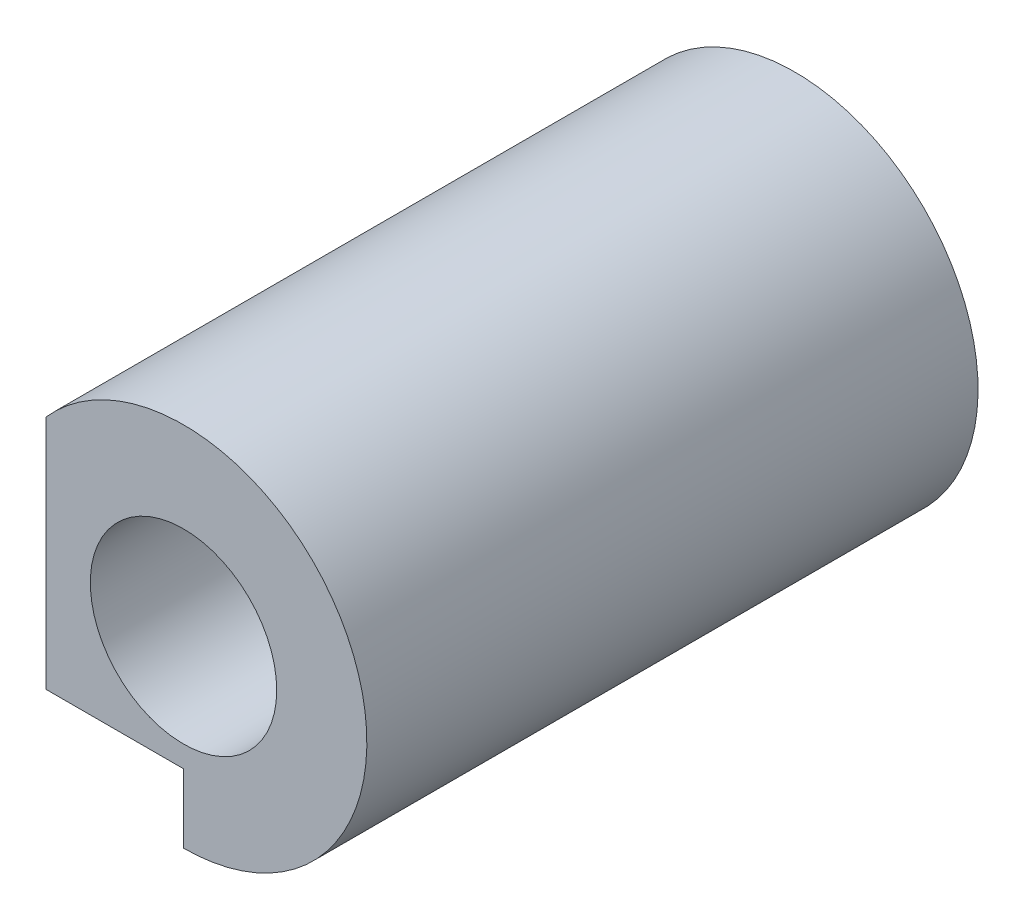
ISO-10303-21;
HEADER;
FILE_DESCRIPTION(('STEP AP214'),'2;1');
FILE_NAME('part.step','',(''),(''),'','','');
FILE_SCHEMA(('AUTOMOTIVE_DESIGN { 1 0 10303 214 1 1 1 1 }'));
ENDSEC;
DATA;
#1=APPLICATION_CONTEXT('core data for automotive mechanical design processes');
#2=APPLICATION_PROTOCOL_DEFINITION('international standard','automotive_design',2000,#1);
#3=PRODUCT_CONTEXT('',#1,'mechanical');
#4=PRODUCT('Part','Part','',(#3));
#5=PRODUCT_RELATED_PRODUCT_CATEGORY('part','',(#4));
#6=PRODUCT_DEFINITION_FORMATION('','',#4);
#7=PRODUCT_DEFINITION_CONTEXT('part definition',#1,'design');
#8=PRODUCT_DEFINITION('design','',#6,#7);
#9=PRODUCT_DEFINITION_SHAPE('','',#8);
#10=(LENGTH_UNIT() NAMED_UNIT(*) SI_UNIT(.MILLI.,.METRE.));
#11=(NAMED_UNIT(*) PLANE_ANGLE_UNIT() SI_UNIT($,.RADIAN.));
#12=(NAMED_UNIT(*) SI_UNIT($,.STERADIAN.) SOLID_ANGLE_UNIT());
#13=UNCERTAINTY_MEASURE_WITH_UNIT(LENGTH_MEASURE(1.E-05),#10,'distance_accuracy_value','');
#14=(GEOMETRIC_REPRESENTATION_CONTEXT(3) GLOBAL_UNCERTAINTY_ASSIGNED_CONTEXT((#13)) GLOBAL_UNIT_ASSIGNED_CONTEXT((#10,
#11,#12)) REPRESENTATION_CONTEXT('',''));
#15=CARTESIAN_POINT('',(0.,0.,0.));
#16=DIRECTION('',(0.,0.,1.));
#17=DIRECTION('',(1.,0.,0.));
#18=AXIS2_PLACEMENT_3D('',#15,#16,#17);
#19=CARTESIAN_POINT('',(0.,0.,20.));
#20=DIRECTION('',(0.,0.,1.));
#21=DIRECTION('',(1.,0.,0.));
#22=AXIS2_PLACEMENT_3D('',#19,#20,#21);
#23=CYLINDRICAL_SURFACE('',#22,3.05);
#24=CARTESIAN_POINT('',(0.,0.,40.));
#25=DIRECTION('',(0.,0.,1.));
#26=DIRECTION('',(1.,0.,0.));
#27=AXIS2_PLACEMENT_3D('',#24,#25,#26);
#28=CIRCLE('',#27,3.05);
#29=CARTESIAN_POINT('',(3.05,0.,40.));
#30=VERTEX_POINT('',#29);
#31=EDGE_CURVE('E9',#30,#30,#28,.T.);
#32=ORIENTED_EDGE('',*,*,#31,.T.);
#33=EDGE_LOOP('',(#32));
#34=FACE_BOUND('',#33,.T.);
#35=CARTESIAN_POINT('',(0.,0.,23.));
#36=DIRECTION('',(0.,0.,1.));
#37=DIRECTION('',(1.,0.,0.));
#38=AXIS2_PLACEMENT_3D('',#35,#36,#37);
#39=CIRCLE('',#38,3.05);
#40=CARTESIAN_POINT('',(3.05,0.,23.));
#41=VERTEX_POINT('',#40);
#42=EDGE_CURVE('E74',#41,#41,#39,.T.);
#43=ORIENTED_EDGE('',*,*,#42,.F.);
#44=EDGE_LOOP('',(#43));
#45=FACE_BOUND('',#44,.T.);
#46=ADVANCED_FACE('F15',(#34,#45),#23,.F.);
#47=CARTESIAN_POINT('',(0.,0.,20.));
#48=DIRECTION('',(0.,0.,-1.));
#49=DIRECTION('',(-1.,0.,0.));
#50=AXIS2_PLACEMENT_3D('',#47,#48,#49);
#51=PLANE('',#50);
#52=DIRECTION('',(0.,1.,0.));
#53=VECTOR('',#52,1.);
#54=CARTESIAN_POINT('',(-4.5,-3.75,20.));
#55=LINE('',#54,#53);
#56=CARTESIAN_POINT('',(-4.5,-3.75,20.));
#57=VERTEX_POINT('',#56);
#58=CARTESIAN_POINT('',(-4.5,3.96862696659688,20.));
#59=VERTEX_POINT('',#58);
#60=EDGE_CURVE('E25',#57,#59,#55,.T.);
#61=ORIENTED_EDGE('',*,*,#60,.T.);
#62=CARTESIAN_POINT('',(0.,0.,20.));
#63=DIRECTION('',(0.,0.,1.));
#64=DIRECTION('',(1.,0.,0.));
#65=AXIS2_PLACEMENT_3D('',#62,#63,#64);
#66=CIRCLE('',#65,6.);
#67=CARTESIAN_POINT('',(0.,-6.,20.));
#68=VERTEX_POINT('',#67);
#69=EDGE_CURVE('E34',#68,#59,#66,.T.);
#70=ORIENTED_EDGE('',*,*,#69,.F.);
#71=DIRECTION('',(0.,1.,0.));
#72=VECTOR('',#71,1.);
#73=CARTESIAN_POINT('',(0.,-6.,20.));
#74=LINE('',#73,#72);
#75=CARTESIAN_POINT('',(0.,-3.75,20.));
#76=VERTEX_POINT('',#75);
#77=EDGE_CURVE('E88',#68,#76,#74,.T.);
#78=ORIENTED_EDGE('',*,*,#77,.T.);
#79=DIRECTION('',(-1.,0.,0.));
#80=VECTOR('',#79,1.);
#81=CARTESIAN_POINT('',(0.,-3.75,20.));
#82=LINE('',#81,#80);
#83=EDGE_CURVE('E71',#76,#57,#82,.T.);
#84=ORIENTED_EDGE('',*,*,#83,.T.);
#85=EDGE_LOOP('',(#61,#70,#78,#84));
#86=FACE_BOUND('',#85,.T.);
#87=ADVANCED_FACE('F99',(#86),#51,.T.);
#88=CARTESIAN_POINT('',(0.,0.,40.));
#89=DIRECTION('',(0.,0.,-1.));
#90=DIRECTION('',(-1.,0.,0.));
#91=AXIS2_PLACEMENT_3D('',#88,#89,#90);
#92=PLANE('',#91);
#93=DIRECTION('',(-1.,0.,0.));
#94=VECTOR('',#93,1.);
#95=CARTESIAN_POINT('',(0.,-3.75,40.));
#96=LINE('',#95,#94);
#97=CARTESIAN_POINT('',(0.,-3.75,40.));
#98=VERTEX_POINT('',#97);
#99=CARTESIAN_POINT('',(-4.5,-3.75,40.));
#100=VERTEX_POINT('',#99);
#101=EDGE_CURVE('E65',#98,#100,#96,.T.);
#102=ORIENTED_EDGE('',*,*,#101,.F.);
#103=DIRECTION('',(0.,1.,0.));
#104=VECTOR('',#103,1.);
#105=CARTESIAN_POINT('',(0.,-6.,40.));
#106=LINE('',#105,#104);
#107=CARTESIAN_POINT('',(0.,-6.,40.));
#108=VERTEX_POINT('',#107);
#109=EDGE_CURVE('E53',#108,#98,#106,.T.);
#110=ORIENTED_EDGE('',*,*,#109,.F.);
#111=CARTESIAN_POINT('',(0.,0.,40.));
#112=DIRECTION('',(0.,0.,1.));
#113=DIRECTION('',(1.,0.,0.));
#114=AXIS2_PLACEMENT_3D('',#111,#112,#113);
#115=CIRCLE('',#114,6.);
#116=CARTESIAN_POINT('',(-4.5,3.96862696659688,40.));
#117=VERTEX_POINT('',#116);
#118=EDGE_CURVE('E67',#108,#117,#115,.T.);
#119=ORIENTED_EDGE('',*,*,#118,.T.);
#120=DIRECTION('',(0.,1.,0.));
#121=VECTOR('',#120,1.);
#122=CARTESIAN_POINT('',(-4.5,-3.75,40.));
#123=LINE('',#122,#121);
#124=EDGE_CURVE('E59',#100,#117,#123,.T.);
#125=ORIENTED_EDGE('',*,*,#124,.F.);
#126=EDGE_LOOP('',(#102,#110,#119,#125));
#127=FACE_BOUND('',#126,.T.);
#128=ORIENTED_EDGE('',*,*,#31,.F.);
#129=EDGE_LOOP('',(#128));
#130=FACE_BOUND('',#129,.T.);
#131=ADVANCED_FACE('F68',(#127,#130),#92,.F.);
#132=CARTESIAN_POINT('',(0.,0.,20.));
#133=DIRECTION('',(0.,0.,1.));
#134=DIRECTION('',(1.,0.,0.));
#135=AXIS2_PLACEMENT_3D('',#132,#133,#134);
#136=CYLINDRICAL_SURFACE('',#135,6.);
#137=ORIENTED_EDGE('',*,*,#118,.F.);
#138=DIRECTION('',(0.,0.,1.));
#139=VECTOR('',#138,1.);
#140=CARTESIAN_POINT('',(0.,-6.,20.));
#141=LINE('',#140,#139);
#142=EDGE_CURVE('E76',#68,#108,#141,.T.);
#143=ORIENTED_EDGE('',*,*,#142,.F.);
#144=ORIENTED_EDGE('',*,*,#69,.T.);
#145=DIRECTION('',(0.,0.,-1.));
#146=VECTOR('',#145,1.);
#147=CARTESIAN_POINT('',(-4.5,3.96862696659688,20.));
#148=LINE('',#147,#146);
#149=EDGE_CURVE('E62',#117,#59,#148,.T.);
#150=ORIENTED_EDGE('',*,*,#149,.F.);
#151=EDGE_LOOP('',(#137,#143,#144,#150));
#152=FACE_BOUND('',#151,.T.);
#153=ADVANCED_FACE('F17',(#152),#136,.T.);
#154=CARTESIAN_POINT('',(0.,-6.,46.));
#155=DIRECTION('',(1.,0.,0.));
#156=DIRECTION('',(0.,0.,-1.));
#157=AXIS2_PLACEMENT_3D('',#154,#155,#156);
#158=PLANE('',#157);
#159=ORIENTED_EDGE('',*,*,#142,.T.);
#160=ORIENTED_EDGE('',*,*,#109,.T.);
#161=DIRECTION('',(0.,0.,-1.));
#162=VECTOR('',#161,1.);
#163=CARTESIAN_POINT('',(0.,-3.75,40.));
#164=LINE('',#163,#162);
#165=EDGE_CURVE('E77',#98,#76,#164,.T.);
#166=ORIENTED_EDGE('',*,*,#165,.T.);
#167=ORIENTED_EDGE('',*,*,#77,.F.);
#168=EDGE_LOOP('',(#159,#160,#166,#167));
#169=FACE_BOUND('',#168,.T.);
#170=ADVANCED_FACE('F115',(#169),#158,.F.);
#171=CARTESIAN_POINT('',(0.,-3.75,46.));
#172=DIRECTION('',(0.,1.,0.));
#173=DIRECTION('',(-1.,0.,0.));
#174=AXIS2_PLACEMENT_3D('',#171,#172,#173);
#175=PLANE('',#174);
#176=ORIENTED_EDGE('',*,*,#83,.F.);
#177=ORIENTED_EDGE('',*,*,#165,.F.);
#178=ORIENTED_EDGE('',*,*,#101,.T.);
#179=DIRECTION('',(0.,0.,1.));
#180=VECTOR('',#179,1.);
#181=CARTESIAN_POINT('',(-4.5,-3.75,20.));
#182=LINE('',#181,#180);
#183=EDGE_CURVE('E19',#57,#100,#182,.T.);
#184=ORIENTED_EDGE('',*,*,#183,.F.);
#185=EDGE_LOOP('',(#176,#177,#178,#184));
#186=FACE_BOUND('',#185,.T.);
#187=ADVANCED_FACE('F112',(#186),#175,.F.);
#188=CARTESIAN_POINT('',(-4.5,-7.31425062258868,65.));
#189=DIRECTION('',(1.,0.,0.));
#190=DIRECTION('',(0.,0.,-1.));
#191=AXIS2_PLACEMENT_3D('',#188,#189,#190);
#192=PLANE('',#191);
#193=ORIENTED_EDGE('',*,*,#124,.T.);
#194=ORIENTED_EDGE('',*,*,#149,.T.);
#195=ORIENTED_EDGE('',*,*,#60,.F.);
#196=ORIENTED_EDGE('',*,*,#183,.T.);
#197=EDGE_LOOP('',(#193,#194,#195,#196));
#198=FACE_BOUND('',#197,.T.);
#199=ADVANCED_FACE('F60',(#198),#192,.F.);
#200=CARTESIAN_POINT('',(0.,0.,23.));
#201=DIRECTION('',(0.,0.,-1.));
#202=DIRECTION('',(-1.,0.,0.));
#203=AXIS2_PLACEMENT_3D('',#200,#201,#202);
#204=PLANE('',#203);
#205=ORIENTED_EDGE('',*,*,#42,.T.);
#206=EDGE_LOOP('',(#205));
#207=FACE_BOUND('',#206,.T.);
#208=ADVANCED_FACE('F96',(#207),#204,.F.);
#209=CLOSED_SHELL('',(#46,#87,#131,#153,#170,#187,#199,#208));
#210=MANIFOLD_SOLID_BREP('B1',#209);
#211=ADVANCED_BREP_SHAPE_REPRESENTATION('',(#18,#210),#14);
#212=SHAPE_DEFINITION_REPRESENTATION(#9,#211);
ENDSEC;
END-ISO-10303-21;
